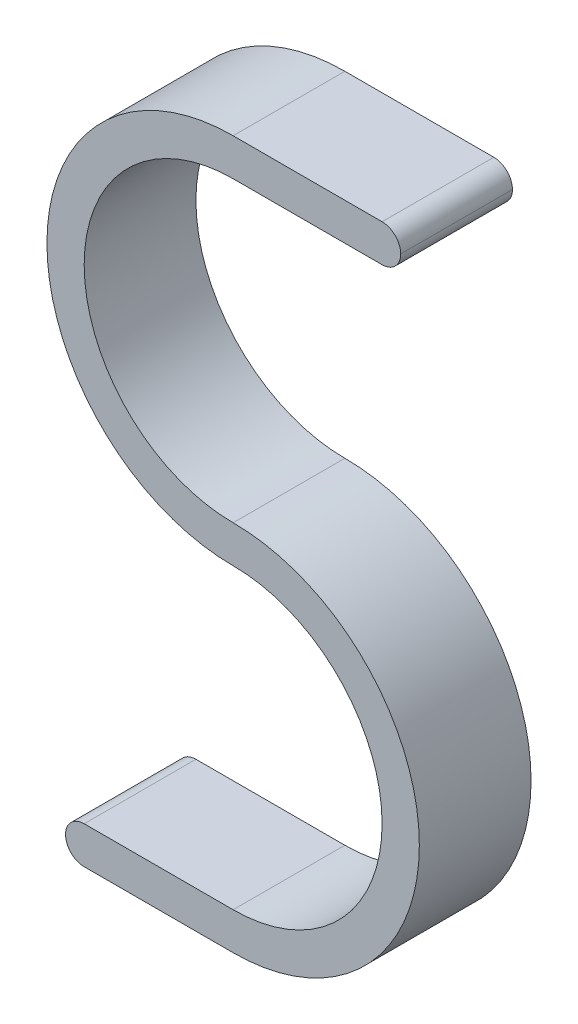
ISO-10303-21;
HEADER;
FILE_DESCRIPTION(('STEP AP214'),'2;1');
FILE_NAME('part.step','',(''),(''),'','','');
FILE_SCHEMA(('AUTOMOTIVE_DESIGN { 1 0 10303 214 1 1 1 1 }'));
ENDSEC;
DATA;
#1=APPLICATION_CONTEXT('core data for automotive mechanical design processes');
#2=APPLICATION_PROTOCOL_DEFINITION('international standard','automotive_design',2000,#1);
#3=PRODUCT_CONTEXT('',#1,'mechanical');
#4=PRODUCT('Part','Part','',(#3));
#5=PRODUCT_RELATED_PRODUCT_CATEGORY('part','',(#4));
#6=PRODUCT_DEFINITION_FORMATION('','',#4);
#7=PRODUCT_DEFINITION_CONTEXT('part definition',#1,'design');
#8=PRODUCT_DEFINITION('design','',#6,#7);
#9=PRODUCT_DEFINITION_SHAPE('','',#8);
#10=(LENGTH_UNIT() NAMED_UNIT(*) SI_UNIT(.MILLI.,.METRE.));
#11=(NAMED_UNIT(*) PLANE_ANGLE_UNIT() SI_UNIT($,.RADIAN.));
#12=(NAMED_UNIT(*) SI_UNIT($,.STERADIAN.) SOLID_ANGLE_UNIT());
#13=UNCERTAINTY_MEASURE_WITH_UNIT(LENGTH_MEASURE(1.E-05),#10,'distance_accuracy_value','');
#14=(GEOMETRIC_REPRESENTATION_CONTEXT(3) GLOBAL_UNCERTAINTY_ASSIGNED_CONTEXT((#13)) GLOBAL_UNIT_ASSIGNED_CONTEXT((#10,
#11,#12)) REPRESENTATION_CONTEXT('',''));
#15=CARTESIAN_POINT('',(0.,0.,0.));
#16=DIRECTION('',(0.,0.,1.));
#17=DIRECTION('',(1.,0.,0.));
#18=AXIS2_PLACEMENT_3D('',#15,#16,#17);
#19=CARTESIAN_POINT('',(4.56975361875606,-13.4777110995891,15.));
#20=DIRECTION('',(0.,0.,-1.));
#21=DIRECTION('',(-1.,0.,0.));
#22=AXIS2_PLACEMENT_3D('',#19,#20,#21);
#23=CYLINDRICAL_SURFACE('',#22,25.);
#24=CARTESIAN_POINT('',(4.56975361875606,-13.4777110995891,0.));
#25=DIRECTION('',(0.,0.,1.));
#26=DIRECTION('',(1.,0.,0.));
#27=AXIS2_PLACEMENT_3D('',#24,#25,#26);
#28=CIRCLE('',#27,25.);
#29=CARTESIAN_POINT('',(4.56975361875606,-38.4777110995892,0.));
#30=VERTEX_POINT('',#29);
#31=CARTESIAN_POINT('',(4.56975361875606,11.5222889004109,0.));
#32=VERTEX_POINT('',#31);
#33=EDGE_CURVE('E154',#30,#32,#28,.T.);
#34=ORIENTED_EDGE('',*,*,#33,.T.);
#35=DIRECTION('',(0.,0.,-1.));
#36=VECTOR('',#35,1.);
#37=CARTESIAN_POINT('',(4.56975361875606,11.5222889004109,15.));
#38=LINE('',#37,#36);
#39=CARTESIAN_POINT('',(4.56975361875606,11.5222889004109,15.));
#40=VERTEX_POINT('',#39);
#41=EDGE_CURVE('E135',#40,#32,#38,.T.);
#42=ORIENTED_EDGE('',*,*,#41,.F.);
#43=CARTESIAN_POINT('',(4.56975361875606,-13.4777110995891,15.));
#44=DIRECTION('',(0.,0.,1.));
#45=DIRECTION('',(1.,0.,0.));
#46=AXIS2_PLACEMENT_3D('',#43,#44,#45);
#47=CIRCLE('',#46,25.);
#48=CARTESIAN_POINT('',(4.56975361875606,-38.4777110995892,15.));
#49=VERTEX_POINT('',#48);
#50=EDGE_CURVE('E142',#49,#40,#47,.T.);
#51=ORIENTED_EDGE('',*,*,#50,.F.);
#52=DIRECTION('',(0.,0.,-1.));
#53=VECTOR('',#52,1.);
#54=CARTESIAN_POINT('',(4.56975361875606,-38.4777110995892,15.));
#55=LINE('',#54,#53);
#56=EDGE_CURVE('E213',#49,#30,#55,.T.);
#57=ORIENTED_EDGE('',*,*,#56,.T.);
#58=EDGE_LOOP('',(#34,#42,#51,#57));
#59=FACE_BOUND('',#58,.T.);
#60=ADVANCED_FACE('F39',(#59),#23,.T.);
#61=CARTESIAN_POINT('',(4.56975245318137,31.5222889004108,15.));
#62=DIRECTION('',(0.,0.,-1.));
#63=DIRECTION('',(-1.,0.,0.));
#64=AXIS2_PLACEMENT_3D('',#61,#62,#63);
#65=CYLINDRICAL_SURFACE('',#64,20.);
#66=CARTESIAN_POINT('',(4.56975245318137,31.5222889004108,0.));
#67=DIRECTION('',(0.,0.,-1.));
#68=DIRECTION('',(1.,0.,0.));
#69=AXIS2_PLACEMENT_3D('',#66,#67,#68);
#70=CIRCLE('',#69,20.);
#71=CARTESIAN_POINT('',(4.56975128760668,51.5222889004108,0.));
#72=VERTEX_POINT('',#71);
#73=EDGE_CURVE('E184',#32,#72,#70,.T.);
#74=ORIENTED_EDGE('',*,*,#73,.T.);
#75=DIRECTION('',(0.,0.,-1.));
#76=VECTOR('',#75,1.);
#77=CARTESIAN_POINT('',(4.56975128760668,51.5222889004108,15.));
#78=LINE('',#77,#76);
#79=CARTESIAN_POINT('',(4.56975128760668,51.5222889004108,15.));
#80=VERTEX_POINT('',#79);
#81=EDGE_CURVE('E138',#80,#72,#78,.T.);
#82=ORIENTED_EDGE('',*,*,#81,.F.);
#83=CARTESIAN_POINT('',(4.56975245318137,31.5222889004108,15.));
#84=DIRECTION('',(0.,0.,-1.));
#85=DIRECTION('',(1.,0.,0.));
#86=AXIS2_PLACEMENT_3D('',#83,#84,#85);
#87=CIRCLE('',#86,20.);
#88=EDGE_CURVE('E131',#40,#80,#87,.T.);
#89=ORIENTED_EDGE('',*,*,#88,.F.);
#90=ORIENTED_EDGE('',*,*,#41,.T.);
#91=EDGE_LOOP('',(#74,#82,#89,#90));
#92=FACE_BOUND('',#91,.T.);
#93=ADVANCED_FACE('F133',(#92),#65,.F.);
#94=CARTESIAN_POINT('',(27.0697524531814,51.5222889004108,15.));
#95=DIRECTION('',(0.,1.,0.));
#96=DIRECTION('',(-1.,0.,0.));
#97=AXIS2_PLACEMENT_3D('',#94,#95,#96);
#98=PLANE('',#97);
#99=DIRECTION('',(1.,0.,0.));
#100=VECTOR('',#99,1.);
#101=CARTESIAN_POINT('',(27.0697524531814,51.5222889004108,0.));
#102=LINE('',#101,#100);
#103=CARTESIAN_POINT('',(24.5697524531814,51.5222889004108,0.));
#104=VERTEX_POINT('',#103);
#105=EDGE_CURVE('E216',#72,#104,#102,.T.);
#106=ORIENTED_EDGE('',*,*,#105,.T.);
#107=DIRECTION('',(0.,0.,-1.));
#108=VECTOR('',#107,1.);
#109=CARTESIAN_POINT('',(24.5697524531814,51.5222889004108,15.));
#110=LINE('',#109,#108);
#111=CARTESIAN_POINT('',(24.5697524531814,51.5222889004108,15.));
#112=VERTEX_POINT('',#111);
#113=EDGE_CURVE('E48',#104,#112,#110,.F.);
#114=ORIENTED_EDGE('',*,*,#113,.T.);
#115=DIRECTION('',(1.,0.,0.));
#116=VECTOR('',#115,1.);
#117=CARTESIAN_POINT('',(27.0697524531814,51.5222889004108,15.));
#118=LINE('',#117,#116);
#119=EDGE_CURVE('E141',#80,#112,#118,.T.);
#120=ORIENTED_EDGE('',*,*,#119,.F.);
#121=ORIENTED_EDGE('',*,*,#81,.T.);
#122=EDGE_LOOP('',(#106,#114,#120,#121));
#123=FACE_BOUND('',#122,.T.);
#124=ADVANCED_FACE('F257',(#123),#98,.F.);
#125=CARTESIAN_POINT('',(4.56975245318137,56.5222889004109,15.));
#126=DIRECTION('',(0.,-1.,0.));
#127=DIRECTION('',(0.,0.,-1.));
#128=AXIS2_PLACEMENT_3D('',#125,#126,#127);
#129=PLANE('',#128);
#130=DIRECTION('',(-1.,0.,0.));
#131=VECTOR('',#130,1.);
#132=CARTESIAN_POINT('',(4.56975245318137,56.5222889004109,15.));
#133=LINE('',#132,#131);
#134=CARTESIAN_POINT('',(24.5697524531814,56.5222889004109,15.));
#135=VERTEX_POINT('',#134);
#136=CARTESIAN_POINT('',(4.56975245318137,56.5222889004109,15.));
#137=VERTEX_POINT('',#136);
#138=EDGE_CURVE('E197',#135,#137,#133,.T.);
#139=ORIENTED_EDGE('',*,*,#138,.F.);
#140=DIRECTION('',(0.,0.,-1.));
#141=VECTOR('',#140,1.);
#142=CARTESIAN_POINT('',(24.5697524531814,56.5222889004109,15.));
#143=LINE('',#142,#141);
#144=CARTESIAN_POINT('',(24.5697524531814,56.5222889004109,0.));
#145=VERTEX_POINT('',#144);
#146=EDGE_CURVE('E11',#135,#145,#143,.T.);
#147=ORIENTED_EDGE('',*,*,#146,.T.);
#148=DIRECTION('',(-1.,0.,0.));
#149=VECTOR('',#148,1.);
#150=CARTESIAN_POINT('',(4.56975245318137,56.5222889004109,0.));
#151=LINE('',#150,#149);
#152=CARTESIAN_POINT('',(4.56975245318137,56.5222889004109,0.));
#153=VERTEX_POINT('',#152);
#154=EDGE_CURVE('E219',#145,#153,#151,.T.);
#155=ORIENTED_EDGE('',*,*,#154,.T.);
#156=DIRECTION('',(0.,0.,-1.));
#157=VECTOR('',#156,1.);
#158=CARTESIAN_POINT('',(4.56975245318137,56.5222889004109,15.));
#159=LINE('',#158,#157);
#160=EDGE_CURVE('E160',#137,#153,#159,.T.);
#161=ORIENTED_EDGE('',*,*,#160,.F.);
#162=EDGE_LOOP('',(#139,#147,#155,#161));
#163=FACE_BOUND('',#162,.T.);
#164=ADVANCED_FACE('F200',(#163),#129,.F.);
#165=CARTESIAN_POINT('',(4.56975245318137,31.5222889004108,15.));
#166=DIRECTION('',(0.,0.,-1.));
#167=DIRECTION('',(-1.,0.,0.));
#168=AXIS2_PLACEMENT_3D('',#165,#166,#167);
#169=CYLINDRICAL_SURFACE('',#168,25.);
#170=CARTESIAN_POINT('',(4.56975245318137,31.5222889004108,0.));
#171=DIRECTION('',(0.,0.,1.));
#172=DIRECTION('',(1.,0.,0.));
#173=AXIS2_PLACEMENT_3D('',#170,#171,#172);
#174=CIRCLE('',#173,25.);
#175=CARTESIAN_POINT('',(4.56975310072285,6.5222889004108,0.));
#176=VERTEX_POINT('',#175);
#177=EDGE_CURVE('E221',#153,#176,#174,.T.);
#178=ORIENTED_EDGE('',*,*,#177,.T.);
#179=DIRECTION('',(0.,0.,-1.));
#180=VECTOR('',#179,1.);
#181=CARTESIAN_POINT('',(4.56975310072285,6.5222889004108,15.));
#182=LINE('',#181,#180);
#183=CARTESIAN_POINT('',(4.56975310072285,6.5222889004108,15.));
#184=VERTEX_POINT('',#183);
#185=EDGE_CURVE('E232',#184,#176,#182,.T.);
#186=ORIENTED_EDGE('',*,*,#185,.F.);
#187=CARTESIAN_POINT('',(4.56975245318137,31.5222889004108,15.));
#188=DIRECTION('',(0.,0.,1.));
#189=DIRECTION('',(1.,0.,0.));
#190=AXIS2_PLACEMENT_3D('',#187,#188,#189);
#191=CIRCLE('',#190,25.);
#192=EDGE_CURVE('E204',#137,#184,#191,.T.);
#193=ORIENTED_EDGE('',*,*,#192,.F.);
#194=ORIENTED_EDGE('',*,*,#160,.T.);
#195=EDGE_LOOP('',(#178,#186,#193,#194));
#196=FACE_BOUND('',#195,.T.);
#197=ADVANCED_FACE('F236',(#196),#169,.T.);
#198=CARTESIAN_POINT('',(4.56975361875606,-13.4777110995891,15.));
#199=DIRECTION('',(0.,0.,-1.));
#200=DIRECTION('',(-1.,0.,0.));
#201=AXIS2_PLACEMENT_3D('',#198,#199,#200);
#202=CYLINDRICAL_SURFACE('',#201,20.);
#203=CARTESIAN_POINT('',(4.56975361875606,-13.4777110995891,0.));
#204=DIRECTION('',(0.,0.,-1.));
#205=DIRECTION('',(1.,0.,0.));
#206=AXIS2_PLACEMENT_3D('',#203,#204,#205);
#207=CIRCLE('',#206,20.);
#208=CARTESIAN_POINT('',(4.56975361875606,-33.4777110995891,0.));
#209=VERTEX_POINT('',#208);
#210=EDGE_CURVE('E223',#176,#209,#207,.T.);
#211=ORIENTED_EDGE('',*,*,#210,.T.);
#212=DIRECTION('',(0.,0.,-1.));
#213=VECTOR('',#212,1.);
#214=CARTESIAN_POINT('',(4.56975361875606,-33.4777110995891,15.));
#215=LINE('',#214,#213);
#216=CARTESIAN_POINT('',(4.56975361875606,-33.4777110995891,15.));
#217=VERTEX_POINT('',#216);
#218=EDGE_CURVE('E229',#217,#209,#215,.T.);
#219=ORIENTED_EDGE('',*,*,#218,.F.);
#220=CARTESIAN_POINT('',(4.56975361875606,-13.4777110995891,15.));
#221=DIRECTION('',(0.,0.,-1.));
#222=DIRECTION('',(1.,0.,0.));
#223=AXIS2_PLACEMENT_3D('',#220,#221,#222);
#224=CIRCLE('',#223,20.);
#225=EDGE_CURVE('E206',#184,#217,#224,.T.);
#226=ORIENTED_EDGE('',*,*,#225,.F.);
#227=ORIENTED_EDGE('',*,*,#185,.T.);
#228=EDGE_LOOP('',(#211,#219,#226,#227));
#229=FACE_BOUND('',#228,.T.);
#230=ADVANCED_FACE('F245',(#229),#202,.F.);
#231=CARTESIAN_POINT('',(-17.9302463812439,-33.4777110995892,15.));
#232=DIRECTION('',(0.,-1.,0.));
#233=DIRECTION('',(0.,0.,-1.));
#234=AXIS2_PLACEMENT_3D('',#231,#232,#233);
#235=PLANE('',#234);
#236=DIRECTION('',(-1.,0.,0.));
#237=VECTOR('',#236,1.);
#238=CARTESIAN_POINT('',(-17.9302463812439,-33.4777110995892,0.));
#239=LINE('',#238,#237);
#240=CARTESIAN_POINT('',(-15.4302463812439,-33.4777110995892,0.));
#241=VERTEX_POINT('',#240);
#242=EDGE_CURVE('E225',#209,#241,#239,.T.);
#243=ORIENTED_EDGE('',*,*,#242,.T.);
#244=DIRECTION('',(0.,0.,-1.));
#245=VECTOR('',#244,1.);
#246=CARTESIAN_POINT('',(-15.4302463812439,-33.4777110995892,15.));
#247=LINE('',#246,#245);
#248=CARTESIAN_POINT('',(-15.4302463812439,-33.4777110995892,15.));
#249=VERTEX_POINT('',#248);
#250=EDGE_CURVE('E64',#241,#249,#247,.F.);
#251=ORIENTED_EDGE('',*,*,#250,.T.);
#252=DIRECTION('',(-1.,0.,0.));
#253=VECTOR('',#252,1.);
#254=CARTESIAN_POINT('',(-17.9302463812439,-33.4777110995892,15.));
#255=LINE('',#254,#253);
#256=EDGE_CURVE('E211',#217,#249,#255,.T.);
#257=ORIENTED_EDGE('',*,*,#256,.F.);
#258=ORIENTED_EDGE('',*,*,#218,.T.);
#259=EDGE_LOOP('',(#243,#251,#257,#258));
#260=FACE_BOUND('',#259,.T.);
#261=ADVANCED_FACE('F247',(#260),#235,.F.);
#262=CARTESIAN_POINT('',(4.56975361875606,-38.4777110995892,15.));
#263=DIRECTION('',(0.,1.,0.));
#264=DIRECTION('',(-1.,0.,0.));
#265=AXIS2_PLACEMENT_3D('',#262,#263,#264);
#266=PLANE('',#265);
#267=DIRECTION('',(1.,0.,0.));
#268=VECTOR('',#267,1.);
#269=CARTESIAN_POINT('',(4.56975361875606,-38.4777110995892,15.));
#270=LINE('',#269,#268);
#271=CARTESIAN_POINT('',(-15.4302463812439,-38.4777110995892,15.));
#272=VERTEX_POINT('',#271);
#273=EDGE_CURVE('E147',#272,#49,#270,.T.);
#274=ORIENTED_EDGE('',*,*,#273,.F.);
#275=DIRECTION('',(0.,0.,-1.));
#276=VECTOR('',#275,1.);
#277=CARTESIAN_POINT('',(-15.4302463812439,-38.4777110995892,15.));
#278=LINE('',#277,#276);
#279=CARTESIAN_POINT('',(-15.4302463812439,-38.4777110995892,0.));
#280=VERTEX_POINT('',#279);
#281=EDGE_CURVE('E155',#272,#280,#278,.T.);
#282=ORIENTED_EDGE('',*,*,#281,.T.);
#283=DIRECTION('',(1.,0.,0.));
#284=VECTOR('',#283,1.);
#285=CARTESIAN_POINT('',(4.56975361875606,-38.4777110995892,0.));
#286=LINE('',#285,#284);
#287=EDGE_CURVE('E151',#280,#30,#286,.T.);
#288=ORIENTED_EDGE('',*,*,#287,.T.);
#289=ORIENTED_EDGE('',*,*,#56,.F.);
#290=EDGE_LOOP('',(#274,#282,#288,#289));
#291=FACE_BOUND('',#290,.T.);
#292=ADVANCED_FACE('F254',(#291),#266,.F.);
#293=CARTESIAN_POINT('',(4.56975361875606,-13.4777110995891,15.));
#294=DIRECTION('',(0.,0.,1.));
#295=DIRECTION('',(1.,0.,0.));
#296=AXIS2_PLACEMENT_3D('',#293,#294,#295);
#297=PLANE('',#296);
#298=CARTESIAN_POINT('',(-15.4302463812439,-35.9777110995892,15.));
#299=DIRECTION('',(0.,0.,1.));
#300=DIRECTION('',(1.,0.,0.));
#301=AXIS2_PLACEMENT_3D('',#298,#299,#300);
#302=CIRCLE('',#301,2.5);
#303=CARTESIAN_POINT('',(-17.9302463812439,-35.9777110995892,15.));
#304=VERTEX_POINT('',#303);
#305=EDGE_CURVE('E56',#249,#304,#302,.T.);
#306=ORIENTED_EDGE('',*,*,#305,.T.);
#307=CARTESIAN_POINT('',(-15.4302463812439,-35.9777110995892,15.));
#308=DIRECTION('',(0.,0.,1.));
#309=DIRECTION('',(1.,0.,0.));
#310=AXIS2_PLACEMENT_3D('',#307,#308,#309);
#311=CIRCLE('',#310,2.5);
#312=EDGE_CURVE('E176',#304,#272,#311,.T.);
#313=ORIENTED_EDGE('',*,*,#312,.T.);
#314=ORIENTED_EDGE('',*,*,#273,.T.);
#315=ORIENTED_EDGE('',*,*,#50,.T.);
#316=ORIENTED_EDGE('',*,*,#88,.T.);
#317=ORIENTED_EDGE('',*,*,#119,.T.);
#318=CARTESIAN_POINT('',(24.5697524531814,54.0222889004108,15.));
#319=DIRECTION('',(0.,0.,1.));
#320=DIRECTION('',(1.,0.,0.));
#321=AXIS2_PLACEMENT_3D('',#318,#319,#320);
#322=CIRCLE('',#321,2.5);
#323=CARTESIAN_POINT('',(27.0697524531814,54.0222889004108,15.));
#324=VERTEX_POINT('',#323);
#325=EDGE_CURVE('E173',#112,#324,#322,.T.);
#326=ORIENTED_EDGE('',*,*,#325,.T.);
#327=CARTESIAN_POINT('',(24.5697524531814,54.0222889004108,15.));
#328=DIRECTION('',(0.,0.,1.));
#329=DIRECTION('',(1.,0.,0.));
#330=AXIS2_PLACEMENT_3D('',#327,#328,#329);
#331=CIRCLE('',#330,2.5);
#332=EDGE_CURVE('E171',#324,#135,#331,.T.);
#333=ORIENTED_EDGE('',*,*,#332,.T.);
#334=ORIENTED_EDGE('',*,*,#138,.T.);
#335=ORIENTED_EDGE('',*,*,#192,.T.);
#336=ORIENTED_EDGE('',*,*,#225,.T.);
#337=ORIENTED_EDGE('',*,*,#256,.T.);
#338=EDGE_LOOP('',(#306,#313,#314,#315,#316,#317,#326,#333,#334,#335,#336,#337));
#339=FACE_BOUND('',#338,.T.);
#340=ADVANCED_FACE('F145',(#339),#297,.T.);
#341=CARTESIAN_POINT('',(4.56975361875606,-13.4777110995891,0.));
#342=DIRECTION('',(0.,0.,1.));
#343=DIRECTION('',(1.,0.,0.));
#344=AXIS2_PLACEMENT_3D('',#341,#342,#343);
#345=PLANE('',#344);
#346=ORIENTED_EDGE('',*,*,#287,.F.);
#347=CARTESIAN_POINT('',(-15.4302463812439,-35.9777110995892,0.));
#348=DIRECTION('',(0.,0.,1.));
#349=DIRECTION('',(1.,0.,0.));
#350=AXIS2_PLACEMENT_3D('',#347,#348,#349);
#351=CIRCLE('',#350,2.5);
#352=CARTESIAN_POINT('',(-17.9302463812439,-35.9777110995892,0.));
#353=VERTEX_POINT('',#352);
#354=EDGE_CURVE('E169',#280,#353,#351,.F.);
#355=ORIENTED_EDGE('',*,*,#354,.T.);
#356=CARTESIAN_POINT('',(-15.4302463812439,-35.9777110995892,0.));
#357=DIRECTION('',(0.,0.,1.));
#358=DIRECTION('',(1.,0.,0.));
#359=AXIS2_PLACEMENT_3D('',#356,#357,#358);
#360=CIRCLE('',#359,2.5);
#361=EDGE_CURVE('E167',#353,#241,#360,.F.);
#362=ORIENTED_EDGE('',*,*,#361,.T.);
#363=ORIENTED_EDGE('',*,*,#242,.F.);
#364=ORIENTED_EDGE('',*,*,#210,.F.);
#365=ORIENTED_EDGE('',*,*,#177,.F.);
#366=ORIENTED_EDGE('',*,*,#154,.F.);
#367=CARTESIAN_POINT('',(24.5697524531814,54.0222889004108,0.));
#368=DIRECTION('',(0.,0.,1.));
#369=DIRECTION('',(1.,0.,0.));
#370=AXIS2_PLACEMENT_3D('',#367,#368,#369);
#371=CIRCLE('',#370,2.5);
#372=CARTESIAN_POINT('',(27.0697524531814,54.0222889004108,0.));
#373=VERTEX_POINT('',#372);
#374=EDGE_CURVE('E158',#145,#373,#371,.F.);
#375=ORIENTED_EDGE('',*,*,#374,.T.);
#376=CARTESIAN_POINT('',(24.5697524531814,54.0222889004108,0.));
#377=DIRECTION('',(0.,0.,1.));
#378=DIRECTION('',(1.,0.,0.));
#379=AXIS2_PLACEMENT_3D('',#376,#377,#378);
#380=CIRCLE('',#379,2.5);
#381=EDGE_CURVE('E165',#373,#104,#380,.F.);
#382=ORIENTED_EDGE('',*,*,#381,.T.);
#383=ORIENTED_EDGE('',*,*,#105,.F.);
#384=ORIENTED_EDGE('',*,*,#73,.F.);
#385=ORIENTED_EDGE('',*,*,#33,.F.);
#386=EDGE_LOOP('',(#346,#355,#362,#363,#364,#365,#366,#375,#382,#383,#384,#385));
#387=FACE_BOUND('',#386,.T.);
#388=ADVANCED_FACE('F241',(#387),#345,.F.);
#389=CARTESIAN_POINT('',(-15.4302463812439,-35.9777110995892,15.));
#390=DIRECTION('',(0.,0.,-1.));
#391=DIRECTION('',(-1.,0.,0.));
#392=AXIS2_PLACEMENT_3D('',#389,#390,#391);
#393=CYLINDRICAL_SURFACE('',#392,2.5);
#394=DIRECTION('',(0.,0.,-1.));
#395=VECTOR('',#394,1.);
#396=CARTESIAN_POINT('',(-17.9302463812439,-35.9777110995892,15.));
#397=LINE('',#396,#395);
#398=EDGE_CURVE('E180',#304,#353,#397,.T.);
#399=ORIENTED_EDGE('',*,*,#398,.F.);
#400=ORIENTED_EDGE('',*,*,#305,.F.);
#401=ORIENTED_EDGE('',*,*,#250,.F.);
#402=ORIENTED_EDGE('',*,*,#361,.F.);
#403=EDGE_LOOP('',(#399,#400,#401,#402));
#404=FACE_BOUND('',#403,.T.);
#405=ADVANCED_FACE('F249',(#404),#393,.T.);
#406=CARTESIAN_POINT('',(-15.4302463812439,-35.9777110995892,15.));
#407=DIRECTION('',(0.,0.,-1.));
#408=DIRECTION('',(-1.,0.,0.));
#409=AXIS2_PLACEMENT_3D('',#406,#407,#408);
#410=CYLINDRICAL_SURFACE('',#409,2.5);
#411=ORIENTED_EDGE('',*,*,#312,.F.);
#412=ORIENTED_EDGE('',*,*,#398,.T.);
#413=ORIENTED_EDGE('',*,*,#354,.F.);
#414=ORIENTED_EDGE('',*,*,#281,.F.);
#415=EDGE_LOOP('',(#411,#412,#413,#414));
#416=FACE_BOUND('',#415,.T.);
#417=ADVANCED_FACE('F252',(#416),#410,.T.);
#418=CARTESIAN_POINT('',(24.5697524531814,54.0222889004108,15.));
#419=DIRECTION('',(0.,0.,-1.));
#420=DIRECTION('',(-1.,0.,0.));
#421=AXIS2_PLACEMENT_3D('',#418,#419,#420);
#422=CYLINDRICAL_SURFACE('',#421,2.5);
#423=ORIENTED_EDGE('',*,*,#146,.F.);
#424=ORIENTED_EDGE('',*,*,#332,.F.);
#425=DIRECTION('',(0.,0.,-1.));
#426=VECTOR('',#425,1.);
#427=CARTESIAN_POINT('',(27.0697524531814,54.0222889004108,15.));
#428=LINE('',#427,#426);
#429=EDGE_CURVE('E43',#373,#324,#428,.F.);
#430=ORIENTED_EDGE('',*,*,#429,.F.);
#431=ORIENTED_EDGE('',*,*,#374,.F.);
#432=EDGE_LOOP('',(#423,#424,#430,#431));
#433=FACE_BOUND('',#432,.T.);
#434=ADVANCED_FACE('F41',(#433),#422,.T.);
#435=CARTESIAN_POINT('',(24.5697524531814,54.0222889004108,15.));
#436=DIRECTION('',(0.,0.,-1.));
#437=DIRECTION('',(-1.,0.,0.));
#438=AXIS2_PLACEMENT_3D('',#435,#436,#437);
#439=CYLINDRICAL_SURFACE('',#438,2.5);
#440=ORIENTED_EDGE('',*,*,#325,.F.);
#441=ORIENTED_EDGE('',*,*,#113,.F.);
#442=ORIENTED_EDGE('',*,*,#381,.F.);
#443=ORIENTED_EDGE('',*,*,#429,.T.);
#444=EDGE_LOOP('',(#440,#441,#442,#443));
#445=FACE_BOUND('',#444,.T.);
#446=ADVANCED_FACE('F190',(#445),#439,.T.);
#447=CLOSED_SHELL('',(#60,#93,#124,#164,#197,#230,#261,#292,#340,#388,#405,#417,#434,#446));
#448=MANIFOLD_SOLID_BREP('B2',#447);
#449=ADVANCED_BREP_SHAPE_REPRESENTATION('',(#18,#448),#14);
#450=SHAPE_DEFINITION_REPRESENTATION(#9,#449);
ENDSEC;
END-ISO-10303-21;
